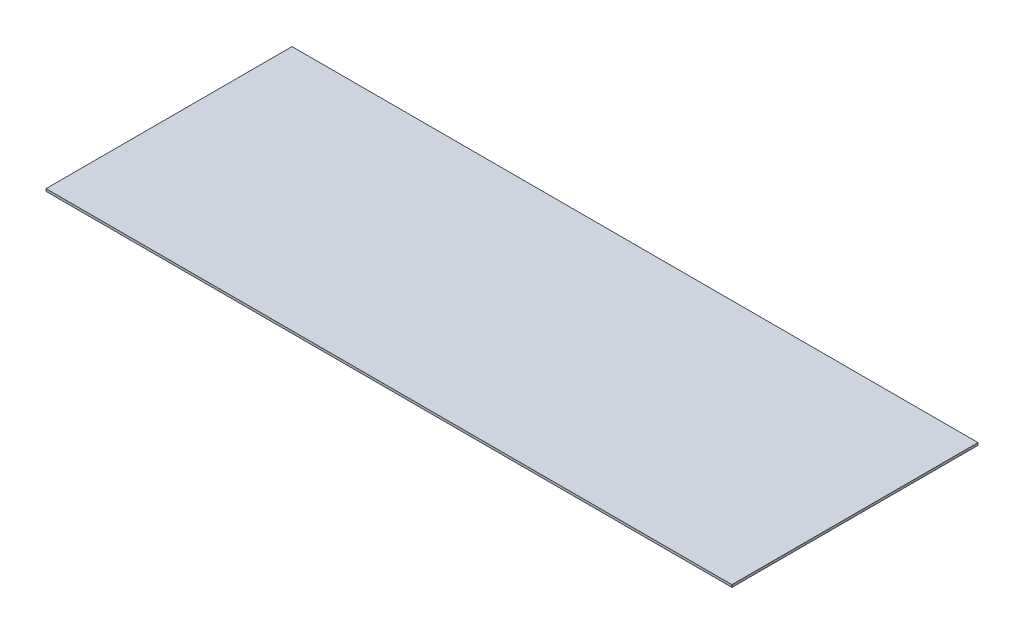
ISO-10303-21;
HEADER;
FILE_DESCRIPTION(('STEP AP214'),'2;1');
FILE_NAME('part.step','',(''),(''),'','','');
FILE_SCHEMA(('AUTOMOTIVE_DESIGN { 1 0 10303 214 1 1 1 1 }'));
ENDSEC;
DATA;
#1=APPLICATION_CONTEXT('core data for automotive mechanical design processes');
#2=APPLICATION_PROTOCOL_DEFINITION('international standard','automotive_design',2000,#1);
#3=PRODUCT_CONTEXT('',#1,'mechanical');
#4=PRODUCT('Part','Part','',(#3));
#5=PRODUCT_RELATED_PRODUCT_CATEGORY('part','',(#4));
#6=PRODUCT_DEFINITION_FORMATION('','',#4);
#7=PRODUCT_DEFINITION_CONTEXT('part definition',#1,'design');
#8=PRODUCT_DEFINITION('design','',#6,#7);
#9=PRODUCT_DEFINITION_SHAPE('','',#8);
#10=(LENGTH_UNIT() NAMED_UNIT(*) SI_UNIT(.MILLI.,.METRE.));
#11=(NAMED_UNIT(*) PLANE_ANGLE_UNIT() SI_UNIT($,.RADIAN.));
#12=(NAMED_UNIT(*) SI_UNIT($,.STERADIAN.) SOLID_ANGLE_UNIT());
#13=UNCERTAINTY_MEASURE_WITH_UNIT(LENGTH_MEASURE(1.E-05),#10,'distance_accuracy_value','');
#14=(GEOMETRIC_REPRESENTATION_CONTEXT(3) GLOBAL_UNCERTAINTY_ASSIGNED_CONTEXT((#13)) GLOBAL_UNIT_ASSIGNED_CONTEXT((#10,
#11,#12)) REPRESENTATION_CONTEXT('',''));
#15=CARTESIAN_POINT('',(0.,0.,0.));
#16=DIRECTION('',(0.,0.,1.));
#17=DIRECTION('',(1.,0.,0.));
#18=AXIS2_PLACEMENT_3D('',#15,#16,#17);
#19=CARTESIAN_POINT('',(28.575,0.2,-10.25));
#20=DIRECTION('',(-1.,0.,0.));
#21=DIRECTION('',(0.,0.,1.));
#22=AXIS2_PLACEMENT_3D('',#19,#20,#21);
#23=PLANE('',#22);
#24=DIRECTION('',(0.,0.,-1.));
#25=VECTOR('',#24,1.);
#26=CARTESIAN_POINT('',(28.575,0.,-10.25));
#27=LINE('',#26,#25);
#28=CARTESIAN_POINT('',(28.575,0.,10.25));
#29=VERTEX_POINT('',#28);
#30=CARTESIAN_POINT('',(28.575,0.,-10.25));
#31=VERTEX_POINT('',#30);
#32=EDGE_CURVE('E96',#29,#31,#27,.T.);
#33=ORIENTED_EDGE('',*,*,#32,.T.);
#34=DIRECTION('',(0.,-1.,0.));
#35=VECTOR('',#34,1.);
#36=CARTESIAN_POINT('',(28.575,0.2,-10.25));
#37=LINE('',#36,#35);
#38=CARTESIAN_POINT('',(28.575,0.2,-10.25));
#39=VERTEX_POINT('',#38);
#40=EDGE_CURVE('E11',#39,#31,#37,.T.);
#41=ORIENTED_EDGE('',*,*,#40,.F.);
#42=DIRECTION('',(0.,0.,-1.));
#43=VECTOR('',#42,1.);
#44=CARTESIAN_POINT('',(28.575,0.2,-10.25));
#45=LINE('',#44,#43);
#46=CARTESIAN_POINT('',(28.575,0.2,10.25));
#47=VERTEX_POINT('',#46);
#48=EDGE_CURVE('E84',#47,#39,#45,.T.);
#49=ORIENTED_EDGE('',*,*,#48,.F.);
#50=DIRECTION('',(0.,-1.,0.));
#51=VECTOR('',#50,1.);
#52=CARTESIAN_POINT('',(28.575,0.2,10.25));
#53=LINE('',#52,#51);
#54=EDGE_CURVE('E92',#47,#29,#53,.T.);
#55=ORIENTED_EDGE('',*,*,#54,.T.);
#56=EDGE_LOOP('',(#33,#41,#49,#55));
#57=FACE_BOUND('',#56,.T.);
#58=ADVANCED_FACE('F33',(#57),#23,.F.);
#59=CARTESIAN_POINT('',(-28.575,0.2,-10.25));
#60=DIRECTION('',(0.,0.,1.));
#61=DIRECTION('',(1.,0.,0.));
#62=AXIS2_PLACEMENT_3D('',#59,#60,#61);
#63=PLANE('',#62);
#64=DIRECTION('',(-1.,0.,0.));
#65=VECTOR('',#64,1.);
#66=CARTESIAN_POINT('',(-28.575,0.,-10.25));
#67=LINE('',#66,#65);
#68=CARTESIAN_POINT('',(-28.575,0.,-10.25));
#69=VERTEX_POINT('',#68);
#70=EDGE_CURVE('E88',#31,#69,#67,.T.);
#71=ORIENTED_EDGE('',*,*,#70,.T.);
#72=DIRECTION('',(0.,-1.,0.));
#73=VECTOR('',#72,1.);
#74=CARTESIAN_POINT('',(-28.575,0.2,-10.25));
#75=LINE('',#74,#73);
#76=CARTESIAN_POINT('',(-28.575,0.2,-10.25));
#77=VERTEX_POINT('',#76);
#78=EDGE_CURVE('E41',#77,#69,#75,.T.);
#79=ORIENTED_EDGE('',*,*,#78,.F.);
#80=DIRECTION('',(-1.,0.,0.));
#81=VECTOR('',#80,1.);
#82=CARTESIAN_POINT('',(-28.575,0.2,-10.25));
#83=LINE('',#82,#81);
#84=EDGE_CURVE('E79',#39,#77,#83,.T.);
#85=ORIENTED_EDGE('',*,*,#84,.F.);
#86=ORIENTED_EDGE('',*,*,#40,.T.);
#87=EDGE_LOOP('',(#71,#79,#85,#86));
#88=FACE_BOUND('',#87,.T.);
#89=ADVANCED_FACE('F87',(#88),#63,.F.);
#90=CARTESIAN_POINT('',(-28.575,0.2,-10.25));
#91=DIRECTION('',(1.,0.,0.));
#92=DIRECTION('',(0.,0.,-1.));
#93=AXIS2_PLACEMENT_3D('',#90,#91,#92);
#94=PLANE('',#93);
#95=DIRECTION('',(0.,0.,1.));
#96=VECTOR('',#95,1.);
#97=CARTESIAN_POINT('',(-28.575,0.,-10.25));
#98=LINE('',#97,#96);
#99=CARTESIAN_POINT('',(-28.575,0.,10.25));
#100=VERTEX_POINT('',#99);
#101=EDGE_CURVE('E66',#69,#100,#98,.T.);
#102=ORIENTED_EDGE('',*,*,#101,.T.);
#103=DIRECTION('',(0.,-1.,0.));
#104=VECTOR('',#103,1.);
#105=CARTESIAN_POINT('',(-28.575,0.2,10.25));
#106=LINE('',#105,#104);
#107=CARTESIAN_POINT('',(-28.575,0.2,10.25));
#108=VERTEX_POINT('',#107);
#109=EDGE_CURVE('E89',#108,#100,#106,.T.);
#110=ORIENTED_EDGE('',*,*,#109,.F.);
#111=DIRECTION('',(0.,0.,1.));
#112=VECTOR('',#111,1.);
#113=CARTESIAN_POINT('',(-28.575,0.2,-10.25));
#114=LINE('',#113,#112);
#115=EDGE_CURVE('E82',#77,#108,#114,.T.);
#116=ORIENTED_EDGE('',*,*,#115,.F.);
#117=ORIENTED_EDGE('',*,*,#78,.T.);
#118=EDGE_LOOP('',(#102,#110,#116,#117));
#119=FACE_BOUND('',#118,.T.);
#120=ADVANCED_FACE('F90',(#119),#94,.F.);
#121=CARTESIAN_POINT('',(-28.575,0.2,10.25));
#122=DIRECTION('',(0.,0.,-1.));
#123=DIRECTION('',(-1.,0.,0.));
#124=AXIS2_PLACEMENT_3D('',#121,#122,#123);
#125=PLANE('',#124);
#126=DIRECTION('',(1.,0.,0.));
#127=VECTOR('',#126,1.);
#128=CARTESIAN_POINT('',(-28.575,0.,10.25));
#129=LINE('',#128,#127);
#130=EDGE_CURVE('E72',#100,#29,#129,.T.);
#131=ORIENTED_EDGE('',*,*,#130,.T.);
#132=ORIENTED_EDGE('',*,*,#54,.F.);
#133=DIRECTION('',(1.,0.,0.));
#134=VECTOR('',#133,1.);
#135=CARTESIAN_POINT('',(-28.575,0.2,10.25));
#136=LINE('',#135,#134);
#137=EDGE_CURVE('E49',#108,#47,#136,.T.);
#138=ORIENTED_EDGE('',*,*,#137,.F.);
#139=ORIENTED_EDGE('',*,*,#109,.T.);
#140=EDGE_LOOP('',(#131,#132,#138,#139));
#141=FACE_BOUND('',#140,.T.);
#142=ADVANCED_FACE('F103',(#141),#125,.F.);
#143=CARTESIAN_POINT('',(0.,0.2,0.));
#144=DIRECTION('',(0.,1.,0.));
#145=DIRECTION('',(0.,0.,1.));
#146=AXIS2_PLACEMENT_3D('',#143,#144,#145);
#147=PLANE('',#146);
#148=ORIENTED_EDGE('',*,*,#48,.T.);
#149=ORIENTED_EDGE('',*,*,#84,.T.);
#150=ORIENTED_EDGE('',*,*,#115,.T.);
#151=ORIENTED_EDGE('',*,*,#137,.T.);
#152=EDGE_LOOP('',(#148,#149,#150,#151));
#153=FACE_BOUND('',#152,.T.);
#154=ADVANCED_FACE('F80',(#153),#147,.T.);
#155=CARTESIAN_POINT('',(0.,0.,0.));
#156=DIRECTION('',(0.,1.,0.));
#157=DIRECTION('',(0.,0.,1.));
#158=AXIS2_PLACEMENT_3D('',#155,#156,#157);
#159=PLANE('',#158);
#160=ORIENTED_EDGE('',*,*,#32,.F.);
#161=ORIENTED_EDGE('',*,*,#130,.F.);
#162=ORIENTED_EDGE('',*,*,#101,.F.);
#163=ORIENTED_EDGE('',*,*,#70,.F.);
#164=EDGE_LOOP('',(#160,#161,#162,#163));
#165=FACE_BOUND('',#164,.T.);
#166=ADVANCED_FACE('F106',(#165),#159,.F.);
#167=CLOSED_SHELL('',(#58,#89,#120,#142,#154,#166));
#168=MANIFOLD_SOLID_BREP('B2',#167);
#169=ADVANCED_BREP_SHAPE_REPRESENTATION('',(#18,#168),#14);
#170=SHAPE_DEFINITION_REPRESENTATION(#9,#169);
ENDSEC;
END-ISO-10303-21;
